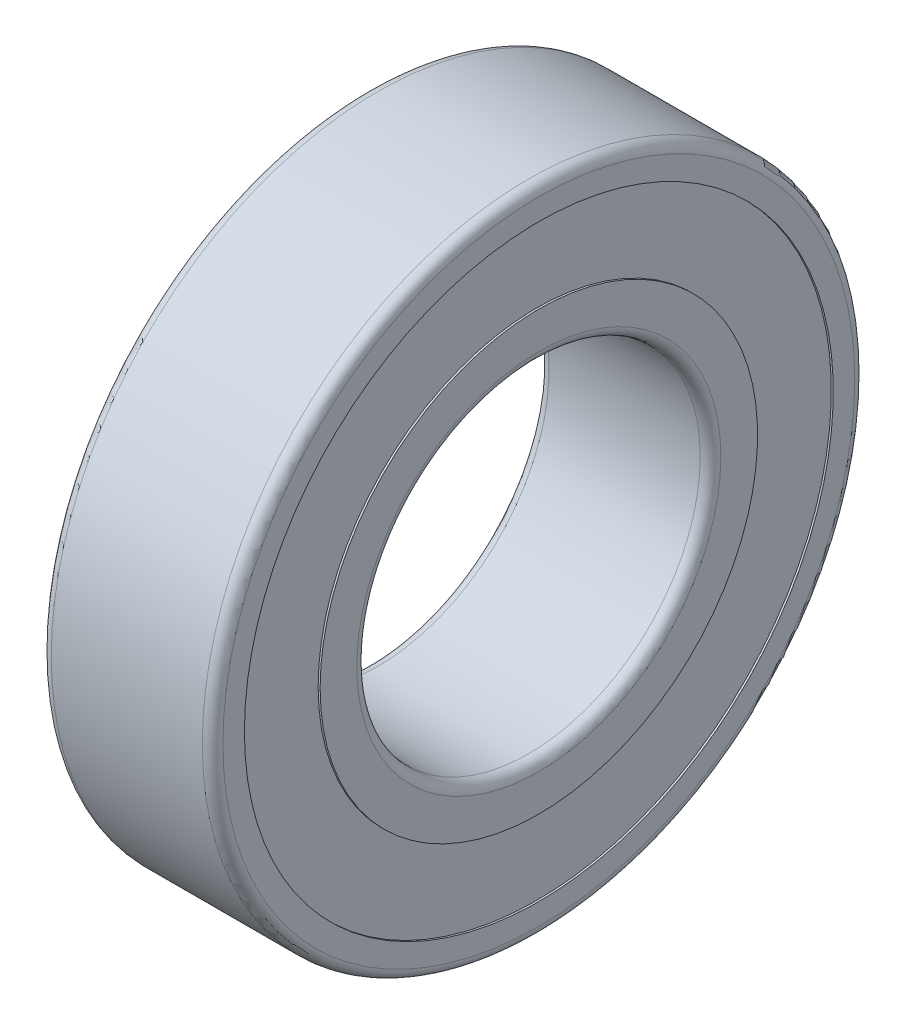
ISO-10303-21;
HEADER;
FILE_DESCRIPTION(('STEP AP214'),'2;1');
FILE_NAME('part.step','',(''),(''),'','','');
FILE_SCHEMA(('AUTOMOTIVE_DESIGN { 1 0 10303 214 1 1 1 1 }'));
ENDSEC;
DATA;
#1=APPLICATION_CONTEXT('core data for automotive mechanical design processes');
#2=APPLICATION_PROTOCOL_DEFINITION('international standard','automotive_design',2000,#1);
#3=PRODUCT_CONTEXT('',#1,'mechanical');
#4=PRODUCT('Part','Part','',(#3));
#5=PRODUCT_RELATED_PRODUCT_CATEGORY('part','',(#4));
#6=PRODUCT_DEFINITION_FORMATION('','',#4);
#7=PRODUCT_DEFINITION_CONTEXT('part definition',#1,'design');
#8=PRODUCT_DEFINITION('design','',#6,#7);
#9=PRODUCT_DEFINITION_SHAPE('','',#8);
#10=(LENGTH_UNIT() NAMED_UNIT(*) SI_UNIT(.MILLI.,.METRE.));
#11=(NAMED_UNIT(*) PLANE_ANGLE_UNIT() SI_UNIT($,.RADIAN.));
#12=(NAMED_UNIT(*) SI_UNIT($,.STERADIAN.) SOLID_ANGLE_UNIT());
#13=UNCERTAINTY_MEASURE_WITH_UNIT(LENGTH_MEASURE(1.E-05),#10,'distance_accuracy_value','');
#14=(GEOMETRIC_REPRESENTATION_CONTEXT(3) GLOBAL_UNCERTAINTY_ASSIGNED_CONTEXT((#13)) GLOBAL_UNIT_ASSIGNED_CONTEXT((#10,
#11,#12)) REPRESENTATION_CONTEXT('',''));
#15=CARTESIAN_POINT('',(0.,0.,0.));
#16=DIRECTION('',(0.,0.,1.));
#17=DIRECTION('',(1.,0.,0.));
#18=AXIS2_PLACEMENT_3D('',#15,#16,#17);
#19=CARTESIAN_POINT('',(0.,0.,0.));
#20=DIRECTION('',(-1.,0.,0.));
#21=DIRECTION('',(0.,0.,1.));
#22=AXIS2_PLACEMENT_3D('',#19,#20,#21);
#23=CYLINDRICAL_SURFACE('',#22,6.37);
#24=CARTESIAN_POINT('',(-0.2575,0.,0.));
#25=DIRECTION('',(-1.,0.,0.));
#26=DIRECTION('',(0.,0.,1.));
#27=AXIS2_PLACEMENT_3D('',#24,#25,#26);
#28=CIRCLE('',#27,6.37);
#29=CARTESIAN_POINT('',(-0.2575,0.,6.37));
#30=VERTEX_POINT('',#29);
#31=EDGE_CURVE('E55',#30,#30,#28,.T.);
#32=ORIENTED_EDGE('',*,*,#31,.T.);
#33=EDGE_LOOP('',(#32));
#34=FACE_BOUND('',#33,.T.);
#35=CARTESIAN_POINT('',(-0.0575000000000003,0.,0.));
#36=DIRECTION('',(-1.,0.,0.));
#37=DIRECTION('',(0.,0.,1.));
#38=AXIS2_PLACEMENT_3D('',#35,#36,#37);
#39=CIRCLE('',#38,6.37);
#40=CARTESIAN_POINT('',(-0.0575000000000003,0.,6.37));
#41=VERTEX_POINT('',#40);
#42=EDGE_CURVE('E11',#41,#41,#39,.T.);
#43=ORIENTED_EDGE('',*,*,#42,.F.);
#44=EDGE_LOOP('',(#43));
#45=FACE_BOUND('',#44,.T.);
#46=ADVANCED_FACE('F41',(#34,#45),#23,.F.);
#47=CARTESIAN_POINT('',(-0.0575000000000003,0.,0.));
#48=DIRECTION('',(-1.,0.,0.));
#49=DIRECTION('',(0.,0.,1.));
#50=AXIS2_PLACEMENT_3D('',#47,#48,#49);
#51=PLANE('',#50);
#52=CARTESIAN_POINT('',(-0.0575000000000003,0.,0.));
#53=DIRECTION('',(-1.,0.,0.));
#54=DIRECTION('',(0.,0.,1.));
#55=AXIS2_PLACEMENT_3D('',#52,#53,#54);
#56=CIRCLE('',#55,8.575);
#57=CARTESIAN_POINT('',(-0.0575000000000003,0.,8.575));
#58=VERTEX_POINT('',#57);
#59=EDGE_CURVE('E47',#58,#58,#56,.T.);
#60=ORIENTED_EDGE('',*,*,#59,.F.);
#61=EDGE_LOOP('',(#60));
#62=FACE_BOUND('',#61,.T.);
#63=ORIENTED_EDGE('',*,*,#42,.T.);
#64=EDGE_LOOP('',(#63));
#65=FACE_BOUND('',#64,.T.);
#66=ADVANCED_FACE('F71',(#62,#65),#51,.F.);
#67=CARTESIAN_POINT('',(0.,0.,0.));
#68=DIRECTION('',(-1.,0.,0.));
#69=DIRECTION('',(0.,0.,1.));
#70=AXIS2_PLACEMENT_3D('',#67,#68,#69);
#71=CYLINDRICAL_SURFACE('',#70,8.575);
#72=ORIENTED_EDGE('',*,*,#59,.T.);
#73=EDGE_LOOP('',(#72));
#74=FACE_BOUND('',#73,.T.);
#75=CARTESIAN_POINT('',(-0.2575,0.,0.));
#76=DIRECTION('',(-1.,0.,0.));
#77=DIRECTION('',(0.,0.,1.));
#78=AXIS2_PLACEMENT_3D('',#75,#76,#77);
#79=CIRCLE('',#78,8.575);
#80=CARTESIAN_POINT('',(-0.2575,0.,8.575));
#81=VERTEX_POINT('',#80);
#82=EDGE_CURVE('E51',#81,#81,#79,.T.);
#83=ORIENTED_EDGE('',*,*,#82,.F.);
#84=EDGE_LOOP('',(#83));
#85=FACE_BOUND('',#84,.T.);
#86=ADVANCED_FACE('F65',(#74,#85),#71,.T.);
#87=CARTESIAN_POINT('',(-0.2575,0.,0.));
#88=DIRECTION('',(-1.,0.,0.));
#89=DIRECTION('',(0.,0.,1.));
#90=AXIS2_PLACEMENT_3D('',#87,#88,#89);
#91=PLANE('',#90);
#92=ORIENTED_EDGE('',*,*,#82,.T.);
#93=EDGE_LOOP('',(#92));
#94=FACE_BOUND('',#93,.T.);
#95=ORIENTED_EDGE('',*,*,#31,.F.);
#96=EDGE_LOOP('',(#95));
#97=FACE_BOUND('',#96,.T.);
#98=ADVANCED_FACE('F63',(#94,#97),#91,.T.);
#99=CLOSED_SHELL('',(#46,#66,#86,#98));
#100=MANIFOLD_SOLID_BREP('B2',#99);
#101=CARTESIAN_POINT('',(-4.9425,0.,0.));
#102=DIRECTION('',(-1.,0.,0.));
#103=DIRECTION('',(0.,0.,1.));
#104=AXIS2_PLACEMENT_3D('',#101,#102,#103);
#105=PLANE('',#104);
#106=CARTESIAN_POINT('',(-4.9425,0.,0.));
#107=DIRECTION('',(-1.,0.,0.));
#108=DIRECTION('',(0.,0.,1.));
#109=AXIS2_PLACEMENT_3D('',#106,#107,#108);
#110=CIRCLE('',#109,8.575);
#111=CARTESIAN_POINT('',(-4.9425,0.,8.575));
#112=VERTEX_POINT('',#111);
#113=EDGE_CURVE('E134',#112,#112,#110,.T.);
#114=ORIENTED_EDGE('',*,*,#113,.T.);
#115=EDGE_LOOP('',(#114));
#116=FACE_BOUND('',#115,.T.);
#117=CARTESIAN_POINT('',(-4.9425,0.,0.));
#118=DIRECTION('',(-1.,0.,0.));
#119=DIRECTION('',(0.,0.,1.));
#120=AXIS2_PLACEMENT_3D('',#117,#118,#119);
#121=CIRCLE('',#120,6.37);
#122=CARTESIAN_POINT('',(-4.9425,0.,6.37));
#123=VERTEX_POINT('',#122);
#124=EDGE_CURVE('E40',#123,#123,#121,.T.);
#125=ORIENTED_EDGE('',*,*,#124,.F.);
#126=EDGE_LOOP('',(#125));
#127=FACE_BOUND('',#126,.T.);
#128=ADVANCED_FACE('F120',(#116,#127),#105,.T.);
#129=CARTESIAN_POINT('',(0.,0.,0.));
#130=DIRECTION('',(-1.,0.,0.));
#131=DIRECTION('',(0.,0.,1.));
#132=AXIS2_PLACEMENT_3D('',#129,#130,#131);
#133=CYLINDRICAL_SURFACE('',#132,6.37);
#134=ORIENTED_EDGE('',*,*,#124,.T.);
#135=EDGE_LOOP('',(#134));
#136=FACE_BOUND('',#135,.T.);
#137=CARTESIAN_POINT('',(-4.7425,0.,0.));
#138=DIRECTION('',(-1.,0.,0.));
#139=DIRECTION('',(0.,0.,1.));
#140=AXIS2_PLACEMENT_3D('',#137,#138,#139);
#141=CIRCLE('',#140,6.37);
#142=CARTESIAN_POINT('',(-4.7425,0.,6.37));
#143=VERTEX_POINT('',#142);
#144=EDGE_CURVE('E126',#143,#143,#141,.T.);
#145=ORIENTED_EDGE('',*,*,#144,.F.);
#146=EDGE_LOOP('',(#145));
#147=FACE_BOUND('',#146,.T.);
#148=ADVANCED_FACE('F150',(#136,#147),#133,.F.);
#149=CARTESIAN_POINT('',(-4.7425,0.,0.));
#150=DIRECTION('',(1.,0.,0.));
#151=DIRECTION('',(0.,0.,-1.));
#152=AXIS2_PLACEMENT_3D('',#149,#150,#151);
#153=PLANE('',#152);
#154=ORIENTED_EDGE('',*,*,#144,.T.);
#155=EDGE_LOOP('',(#154));
#156=FACE_BOUND('',#155,.T.);
#157=CARTESIAN_POINT('',(-4.7425,0.,0.));
#158=DIRECTION('',(-1.,0.,0.));
#159=DIRECTION('',(0.,0.,1.));
#160=AXIS2_PLACEMENT_3D('',#157,#158,#159);
#161=CIRCLE('',#160,8.575);
#162=CARTESIAN_POINT('',(-4.7425,0.,8.575));
#163=VERTEX_POINT('',#162);
#164=EDGE_CURVE('E130',#163,#163,#161,.T.);
#165=ORIENTED_EDGE('',*,*,#164,.F.);
#166=EDGE_LOOP('',(#165));
#167=FACE_BOUND('',#166,.T.);
#168=ADVANCED_FACE('F144',(#156,#167),#153,.T.);
#169=CARTESIAN_POINT('',(0.,0.,0.));
#170=DIRECTION('',(-1.,0.,0.));
#171=DIRECTION('',(0.,0.,1.));
#172=AXIS2_PLACEMENT_3D('',#169,#170,#171);
#173=CYLINDRICAL_SURFACE('',#172,8.575);
#174=ORIENTED_EDGE('',*,*,#164,.T.);
#175=EDGE_LOOP('',(#174));
#176=FACE_BOUND('',#175,.T.);
#177=ORIENTED_EDGE('',*,*,#113,.F.);
#178=EDGE_LOOP('',(#177));
#179=FACE_BOUND('',#178,.T.);
#180=ADVANCED_FACE('F142',(#176,#179),#173,.T.);
#181=CLOSED_SHELL('',(#128,#148,#168,#180));
#182=MANIFOLD_SOLID_BREP('B6',#181);
#183=CARTESIAN_POINT('',(-2.5,6.04537949046685,4.39222529775543));
#184=DIRECTION('',(-1.,0.,0.));
#185=DIRECTION('',(0.,0.809016994374955,0.587785252292462));
#186=AXIS2_PLACEMENT_3D('',#183,#184,#185);
#187=SPHERICAL_SURFACE('',#186,1.25);
#188=CARTESIAN_POINT('',(-3.75,6.04537949046685,4.39222529775543));
#189=VERTEX_POINT('',#188);
#190=VERTEX_LOOP('',#189);
#191=FACE_BOUND('',#190,.T.);
#192=ADVANCED_FACE('F199',(#191),#187,.T.);
#193=CLOSED_SHELL('',(#192));
#194=MANIFOLD_SOLID_BREP('B35',#193);
#195=CARTESIAN_POINT('',(-2.5,2.30912949046688,7.10676981801551));
#196=DIRECTION('',(-1.,0.,0.));
#197=DIRECTION('',(0.,0.309016994374958,0.95105651629515));
#198=AXIS2_PLACEMENT_3D('',#195,#196,#197);
#199=SPHERICAL_SURFACE('',#198,1.25);
#200=CARTESIAN_POINT('',(-3.75,2.30912949046688,7.10676981801551));
#201=VERTEX_POINT('',#200);
#202=VERTEX_LOOP('',#201);
#203=FACE_BOUND('',#202,.T.);
#204=ADVANCED_FACE('F220',(#203),#199,.T.);
#205=CLOSED_SHELL('',(#204));
#206=MANIFOLD_SOLID_BREP('B116',#205);
#207=CARTESIAN_POINT('',(-2.5,-2.30912949046673,7.10676981801556));
#208=DIRECTION('',(-1.,0.,0.));
#209=DIRECTION('',(0.,-0.309016994374938,0.951056516295157));
#210=AXIS2_PLACEMENT_3D('',#207,#208,#209);
#211=SPHERICAL_SURFACE('',#210,1.25);
#212=CARTESIAN_POINT('',(-3.75,-2.30912949046673,7.10676981801556));
#213=VERTEX_POINT('',#212);
#214=VERTEX_LOOP('',#213);
#215=FACE_BOUND('',#214,.T.);
#216=ADVANCED_FACE('F241',(#215),#211,.T.);
#217=CLOSED_SHELL('',(#216));
#218=MANIFOLD_SOLID_BREP('B195',#217);
#219=CARTESIAN_POINT('',(-2.5,-6.04537949046676,4.39222529775556));
#220=DIRECTION('',(-1.,0.,0.));
#221=DIRECTION('',(0.,-0.809016994374942,0.58778525229248));
#222=AXIS2_PLACEMENT_3D('',#219,#220,#221);
#223=SPHERICAL_SURFACE('',#222,1.25);
#224=CARTESIAN_POINT('',(-3.75,-6.04537949046676,4.39222529775556));
#225=VERTEX_POINT('',#224);
#226=VERTEX_LOOP('',#225);
#227=FACE_BOUND('',#226,.T.);
#228=ADVANCED_FACE('F262',(#227),#223,.T.);
#229=CLOSED_SHELL('',(#228));
#230=MANIFOLD_SOLID_BREP('B216',#229);
#231=CARTESIAN_POINT('',(-2.5,-7.4725,0.));
#232=DIRECTION('',(-1.,0.,0.));
#233=DIRECTION('',(0.,-1.,0.));
#234=AXIS2_PLACEMENT_3D('',#231,#232,#233);
#235=SPHERICAL_SURFACE('',#234,1.25);
#236=CARTESIAN_POINT('',(-3.75,-7.4725,0.));
#237=VERTEX_POINT('',#236);
#238=VERTEX_LOOP('',#237);
#239=FACE_BOUND('',#238,.T.);
#240=ADVANCED_FACE('F283',(#239),#235,.T.);
#241=CLOSED_SHELL('',(#240));
#242=MANIFOLD_SOLID_BREP('B237',#241);
#243=CARTESIAN_POINT('',(-2.5,-6.04537949046682,-4.39222529775547));
#244=DIRECTION('',(-1.,0.,0.));
#245=DIRECTION('',(0.,-0.809016994374951,-0.587785252292469));
#246=AXIS2_PLACEMENT_3D('',#243,#244,#245);
#247=SPHERICAL_SURFACE('',#246,1.25);
#248=CARTESIAN_POINT('',(-3.75,-6.04537949046682,-4.39222529775547));
#249=VERTEX_POINT('',#248);
#250=VERTEX_LOOP('',#249);
#251=FACE_BOUND('',#250,.T.);
#252=ADVANCED_FACE('F304',(#251),#247,.T.);
#253=CLOSED_SHELL('',(#252));
#254=MANIFOLD_SOLID_BREP('B258',#253);
#255=CARTESIAN_POINT('',(-2.5,-2.30912949046683,-7.10676981801553));
#256=DIRECTION('',(-1.,0.,0.));
#257=DIRECTION('',(0.,-0.309016994374952,-0.951056516295152));
#258=AXIS2_PLACEMENT_3D('',#255,#256,#257);
#259=SPHERICAL_SURFACE('',#258,1.25);
#260=CARTESIAN_POINT('',(-3.75,-2.30912949046683,-7.10676981801553));
#261=VERTEX_POINT('',#260);
#262=VERTEX_LOOP('',#261);
#263=FACE_BOUND('',#262,.T.);
#264=ADVANCED_FACE('F325',(#263),#259,.T.);
#265=CLOSED_SHELL('',(#264));
#266=MANIFOLD_SOLID_BREP('B279',#265);
#267=CARTESIAN_POINT('',(-2.5,2.30912949046677,-7.10676981801554));
#268=DIRECTION('',(-1.,0.,0.));
#269=DIRECTION('',(0.,0.309016994374945,-0.951056516295155));
#270=AXIS2_PLACEMENT_3D('',#267,#268,#269);
#271=SPHERICAL_SURFACE('',#270,1.25);
#272=CARTESIAN_POINT('',(-3.75,2.30912949046677,-7.10676981801554));
#273=VERTEX_POINT('',#272);
#274=VERTEX_LOOP('',#273);
#275=FACE_BOUND('',#274,.T.);
#276=ADVANCED_FACE('F346',(#275),#271,.T.);
#277=CLOSED_SHELL('',(#276));
#278=MANIFOLD_SOLID_BREP('B300',#277);
#279=CARTESIAN_POINT('',(-2.5,6.04537949046679,-4.39222529775551));
#280=DIRECTION('',(-1.,0.,0.));
#281=DIRECTION('',(0.,0.809016994374947,-0.587785252292474));
#282=AXIS2_PLACEMENT_3D('',#279,#280,#281);
#283=SPHERICAL_SURFACE('',#282,1.25);
#284=CARTESIAN_POINT('',(-3.75,6.04537949046679,-4.39222529775551));
#285=VERTEX_POINT('',#284);
#286=VERTEX_LOOP('',#285);
#287=FACE_BOUND('',#286,.T.);
#288=ADVANCED_FACE('F367',(#287),#283,.T.);
#289=CLOSED_SHELL('',(#288));
#290=MANIFOLD_SOLID_BREP('B321',#289);
#291=CARTESIAN_POINT('',(-2.5,7.4725,0.));
#292=DIRECTION('',(-1.,0.,0.));
#293=DIRECTION('',(0.,1.,0.));
#294=AXIS2_PLACEMENT_3D('',#291,#292,#293);
#295=SPHERICAL_SURFACE('',#294,1.25);
#296=CARTESIAN_POINT('',(-3.75,7.4725,0.));
#297=VERTEX_POINT('',#296);
#298=VERTEX_LOOP('',#297);
#299=FACE_BOUND('',#298,.T.);
#300=ADVANCED_FACE('F390',(#299),#295,.T.);
#301=CLOSED_SHELL('',(#300));
#302=MANIFOLD_SOLID_BREP('B342',#301);
#303=CARTESIAN_POINT('',(0.,0.,0.));
#304=DIRECTION('',(-1.,0.,0.));
#305=DIRECTION('',(0.,0.,1.));
#306=AXIS2_PLACEMENT_3D('',#303,#304,#305);
#307=CYLINDRICAL_SURFACE('',#306,8.4225);
#308=CARTESIAN_POINT('',(-3.3124038404636,0.,0.));
#309=DIRECTION('',(-1.,0.,0.));
#310=DIRECTION('',(0.,0.,1.));
#311=AXIS2_PLACEMENT_3D('',#308,#309,#310);
#312=CIRCLE('',#311,8.4225);
#313=CARTESIAN_POINT('',(-3.3124038404636,0.,8.4225));
#314=VERTEX_POINT('',#313);
#315=EDGE_CURVE('E432',#314,#314,#312,.T.);
#316=ORIENTED_EDGE('',*,*,#315,.F.);
#317=EDGE_LOOP('',(#316));
#318=FACE_BOUND('',#317,.T.);
#319=CARTESIAN_POINT('',(-4.7425,0.,0.));
#320=DIRECTION('',(-1.,0.,0.));
#321=DIRECTION('',(0.,0.,1.));
#322=AXIS2_PLACEMENT_3D('',#319,#320,#321);
#323=CIRCLE('',#322,8.4225);
#324=CARTESIAN_POINT('',(-4.7425,0.,8.4225));
#325=VERTEX_POINT('',#324);
#326=EDGE_CURVE('E453',#325,#325,#323,.T.);
#327=ORIENTED_EDGE('',*,*,#326,.T.);
#328=EDGE_LOOP('',(#327));
#329=FACE_BOUND('',#328,.T.);
#330=ADVANCED_FACE('F412',(#318,#329),#307,.F.);
#331=CARTESIAN_POINT('',(-2.5,0.,0.));
#332=DIRECTION('',(-1.,0.,0.));
#333=DIRECTION('',(0.,0.,1.));
#334=AXIS2_PLACEMENT_3D('',#331,#332,#333);
#335=TOROIDAL_SURFACE('',#334,7.4725,1.25);
#336=CARTESIAN_POINT('',(-1.6875961595364,0.,0.));
#337=DIRECTION('',(-1.,0.,0.));
#338=DIRECTION('',(0.,0.,1.));
#339=AXIS2_PLACEMENT_3D('',#336,#337,#338);
#340=CIRCLE('',#339,8.4225);
#341=CARTESIAN_POINT('',(-1.6875961595364,0.,8.4225));
#342=VERTEX_POINT('',#341);
#343=EDGE_CURVE('E435',#342,#342,#340,.T.);
#344=ORIENTED_EDGE('',*,*,#343,.F.);
#345=EDGE_LOOP('',(#344));
#346=FACE_BOUND('',#345,.T.);
#347=ORIENTED_EDGE('',*,*,#315,.T.);
#348=EDGE_LOOP('',(#347));
#349=FACE_BOUND('',#348,.T.);
#350=ADVANCED_FACE('F482',(#346,#349),#335,.F.);
#351=CARTESIAN_POINT('',(0.,0.,0.));
#352=DIRECTION('',(-1.,0.,0.));
#353=DIRECTION('',(0.,0.,1.));
#354=AXIS2_PLACEMENT_3D('',#351,#352,#353);
#355=CYLINDRICAL_SURFACE('',#354,8.4225);
#356=CARTESIAN_POINT('',(-0.2575,0.,0.));
#357=DIRECTION('',(-1.,0.,0.));
#358=DIRECTION('',(0.,0.,1.));
#359=AXIS2_PLACEMENT_3D('',#356,#357,#358);
#360=CIRCLE('',#359,8.4225);
#361=CARTESIAN_POINT('',(-0.2575,0.,8.4225));
#362=VERTEX_POINT('',#361);
#363=EDGE_CURVE('E438',#362,#362,#360,.T.);
#364=ORIENTED_EDGE('',*,*,#363,.F.);
#365=EDGE_LOOP('',(#364));
#366=FACE_BOUND('',#365,.T.);
#367=ORIENTED_EDGE('',*,*,#343,.T.);
#368=EDGE_LOOP('',(#367));
#369=FACE_BOUND('',#368,.T.);
#370=ADVANCED_FACE('F488',(#366,#369),#355,.F.);
#371=CARTESIAN_POINT('',(-0.2575,0.,0.));
#372=DIRECTION('',(-1.,0.,0.));
#373=DIRECTION('',(0.,0.,1.));
#374=AXIS2_PLACEMENT_3D('',#371,#372,#373);
#375=PLANE('',#374);
#376=CARTESIAN_POINT('',(-0.2575,0.,0.));
#377=DIRECTION('',(-1.,0.,0.));
#378=DIRECTION('',(0.,0.,1.));
#379=AXIS2_PLACEMENT_3D('',#376,#377,#378);
#380=CIRCLE('',#379,8.575);
#381=CARTESIAN_POINT('',(-0.2575,0.,8.575));
#382=VERTEX_POINT('',#381);
#383=EDGE_CURVE('E441',#382,#382,#380,.T.);
#384=ORIENTED_EDGE('',*,*,#383,.F.);
#385=EDGE_LOOP('',(#384));
#386=FACE_BOUND('',#385,.T.);
#387=ORIENTED_EDGE('',*,*,#363,.T.);
#388=EDGE_LOOP('',(#387));
#389=FACE_BOUND('',#388,.T.);
#390=ADVANCED_FACE('F552',(#386,#389),#375,.F.);
#391=CARTESIAN_POINT('',(0.,0.,0.));
#392=DIRECTION('',(-1.,0.,0.));
#393=DIRECTION('',(0.,0.,1.));
#394=AXIS2_PLACEMENT_3D('',#391,#392,#393);
#395=CYLINDRICAL_SURFACE('',#394,8.575);
#396=CARTESIAN_POINT('',(0.,0.,0.));
#397=DIRECTION('',(-1.,0.,0.));
#398=DIRECTION('',(0.,0.,1.));
#399=AXIS2_PLACEMENT_3D('',#396,#397,#398);
#400=CIRCLE('',#399,8.575);
#401=CARTESIAN_POINT('',(0.,0.,8.575));
#402=VERTEX_POINT('',#401);
#403=EDGE_CURVE('E444',#402,#402,#400,.T.);
#404=ORIENTED_EDGE('',*,*,#403,.F.);
#405=EDGE_LOOP('',(#404));
#406=FACE_BOUND('',#405,.T.);
#407=ORIENTED_EDGE('',*,*,#383,.T.);
#408=EDGE_LOOP('',(#407));
#409=FACE_BOUND('',#408,.T.);
#410=ADVANCED_FACE('F531',(#406,#409),#395,.F.);
#411=CARTESIAN_POINT('',(0.,0.,0.));
#412=DIRECTION('',(-1.,0.,0.));
#413=DIRECTION('',(0.,0.,1.));
#414=AXIS2_PLACEMENT_3D('',#411,#412,#413);
#415=PLANE('',#414);
#416=CARTESIAN_POINT('',(0.,0.,0.));
#417=DIRECTION('',(-1.,0.,0.));
#418=DIRECTION('',(0.,0.,1.));
#419=AXIS2_PLACEMENT_3D('',#416,#417,#418);
#420=CIRCLE('',#419,9.2);
#421=CARTESIAN_POINT('',(0.,0.,9.2));
#422=VERTEX_POINT('',#421);
#423=EDGE_CURVE('E419',#422,#422,#420,.F.);
#424=ORIENTED_EDGE('',*,*,#423,.T.);
#425=EDGE_LOOP('',(#424));
#426=FACE_BOUND('',#425,.T.);
#427=ORIENTED_EDGE('',*,*,#403,.T.);
#428=EDGE_LOOP('',(#427));
#429=FACE_BOUND('',#428,.T.);
#430=ADVANCED_FACE('F478',(#426,#429),#415,.F.);
#431=CARTESIAN_POINT('',(0.,0.,0.));
#432=DIRECTION('',(-1.,0.,0.));
#433=DIRECTION('',(0.,0.,1.));
#434=AXIS2_PLACEMENT_3D('',#431,#432,#433);
#435=CYLINDRICAL_SURFACE('',#434,9.5);
#436=CARTESIAN_POINT('',(-0.3,0.,0.));
#437=DIRECTION('',(-1.,0.,0.));
#438=DIRECTION('',(0.,0.,1.));
#439=AXIS2_PLACEMENT_3D('',#436,#437,#438);
#440=CIRCLE('',#439,9.5);
#441=CARTESIAN_POINT('',(-0.3,0.,9.5));
#442=VERTEX_POINT('',#441);
#443=EDGE_CURVE('E423',#442,#442,#440,.T.);
#444=ORIENTED_EDGE('',*,*,#443,.T.);
#445=EDGE_LOOP('',(#444));
#446=FACE_BOUND('',#445,.T.);
#447=CARTESIAN_POINT('',(-4.7,0.,0.));
#448=DIRECTION('',(1.,0.,0.));
#449=DIRECTION('',(0.,0.,-1.));
#450=AXIS2_PLACEMENT_3D('',#447,#448,#449);
#451=CIRCLE('',#450,9.5);
#452=CARTESIAN_POINT('',(-4.7,0.,-9.5));
#453=VERTEX_POINT('',#452);
#454=EDGE_CURVE('E427',#453,#453,#451,.T.);
#455=ORIENTED_EDGE('',*,*,#454,.T.);
#456=EDGE_LOOP('',(#455));
#457=FACE_BOUND('',#456,.T.);
#458=ADVANCED_FACE('F473',(#446,#457),#435,.T.);
#459=CARTESIAN_POINT('',(-5.,0.,0.));
#460=DIRECTION('',(1.,0.,0.));
#461=DIRECTION('',(0.,0.,-1.));
#462=AXIS2_PLACEMENT_3D('',#459,#460,#461);
#463=PLANE('',#462);
#464=CARTESIAN_POINT('',(-5.,0.,0.));
#465=DIRECTION('',(1.,0.,0.));
#466=DIRECTION('',(0.,0.,-1.));
#467=AXIS2_PLACEMENT_3D('',#464,#465,#466);
#468=CIRCLE('',#467,9.2);
#469=CARTESIAN_POINT('',(-5.,0.,-9.2));
#470=VERTEX_POINT('',#469);
#471=EDGE_CURVE('E389',#470,#470,#468,.F.);
#472=ORIENTED_EDGE('',*,*,#471,.T.);
#473=EDGE_LOOP('',(#472));
#474=FACE_BOUND('',#473,.T.);
#475=CARTESIAN_POINT('',(-5.,0.,0.));
#476=DIRECTION('',(-1.,0.,0.));
#477=DIRECTION('',(0.,0.,1.));
#478=AXIS2_PLACEMENT_3D('',#475,#476,#477);
#479=CIRCLE('',#478,8.575);
#480=CARTESIAN_POINT('',(-5.,0.,8.575));
#481=VERTEX_POINT('',#480);
#482=EDGE_CURVE('E447',#481,#481,#479,.T.);
#483=ORIENTED_EDGE('',*,*,#482,.F.);
#484=EDGE_LOOP('',(#483));
#485=FACE_BOUND('',#484,.T.);
#486=ADVANCED_FACE('F468',(#474,#485),#463,.F.);
#487=CARTESIAN_POINT('',(0.,0.,0.));
#488=DIRECTION('',(-1.,0.,0.));
#489=DIRECTION('',(0.,0.,1.));
#490=AXIS2_PLACEMENT_3D('',#487,#488,#489);
#491=CYLINDRICAL_SURFACE('',#490,8.575);
#492=CARTESIAN_POINT('',(-4.7425,0.,0.));
#493=DIRECTION('',(-1.,0.,0.));
#494=DIRECTION('',(0.,0.,1.));
#495=AXIS2_PLACEMENT_3D('',#492,#493,#494);
#496=CIRCLE('',#495,8.575);
#497=CARTESIAN_POINT('',(-4.7425,0.,8.575));
#498=VERTEX_POINT('',#497);
#499=EDGE_CURVE('E450',#498,#498,#496,.T.);
#500=ORIENTED_EDGE('',*,*,#499,.F.);
#501=EDGE_LOOP('',(#500));
#502=FACE_BOUND('',#501,.T.);
#503=ORIENTED_EDGE('',*,*,#482,.T.);
#504=EDGE_LOOP('',(#503));
#505=FACE_BOUND('',#504,.T.);
#506=ADVANCED_FACE('F462',(#502,#505),#491,.F.);
#507=CARTESIAN_POINT('',(-4.7425,0.,0.));
#508=DIRECTION('',(1.,0.,0.));
#509=DIRECTION('',(0.,0.,-1.));
#510=AXIS2_PLACEMENT_3D('',#507,#508,#509);
#511=PLANE('',#510);
#512=ORIENTED_EDGE('',*,*,#326,.F.);
#513=EDGE_LOOP('',(#512));
#514=FACE_BOUND('',#513,.T.);
#515=ORIENTED_EDGE('',*,*,#499,.T.);
#516=EDGE_LOOP('',(#515));
#517=FACE_BOUND('',#516,.T.);
#518=ADVANCED_FACE('F458',(#514,#517),#511,.F.);
#519=CARTESIAN_POINT('',(-0.3,0.,0.));
#520=DIRECTION('',(-1.,0.,0.));
#521=DIRECTION('',(0.,0.,1.));
#522=AXIS2_PLACEMENT_3D('',#519,#520,#521);
#523=TOROIDAL_SURFACE('',#522,9.2,0.3);
#524=ORIENTED_EDGE('',*,*,#423,.F.);
#525=EDGE_LOOP('',(#524));
#526=FACE_BOUND('',#525,.T.);
#527=ORIENTED_EDGE('',*,*,#443,.F.);
#528=EDGE_LOOP('',(#527));
#529=FACE_BOUND('',#528,.T.);
#530=ADVANCED_FACE('F461',(#526,#529),#523,.T.);
#531=CARTESIAN_POINT('',(-4.7,0.,0.));
#532=DIRECTION('',(1.,0.,0.));
#533=DIRECTION('',(0.,0.,-1.));
#534=AXIS2_PLACEMENT_3D('',#531,#532,#533);
#535=TOROIDAL_SURFACE('',#534,9.2,0.3);
#536=ORIENTED_EDGE('',*,*,#454,.F.);
#537=EDGE_LOOP('',(#536));
#538=FACE_BOUND('',#537,.T.);
#539=ORIENTED_EDGE('',*,*,#471,.F.);
#540=EDGE_LOOP('',(#539));
#541=FACE_BOUND('',#540,.T.);
#542=ADVANCED_FACE('F414',(#538,#541),#535,.T.);
#543=CLOSED_SHELL('',(#330,#350,#370,#390,#410,#430,#458,#486,#506,#518,#530,#542));
#544=MANIFOLD_SOLID_BREP('B363',#543);
#545=CARTESIAN_POINT('',(-2.5,0.,0.));
#546=DIRECTION('',(-1.,0.,0.));
#547=DIRECTION('',(0.,0.,1.));
#548=AXIS2_PLACEMENT_3D('',#545,#546,#547);
#549=TOROIDAL_SURFACE('',#548,7.4725,1.25);
#550=CARTESIAN_POINT('',(-1.6875961595364,0.,0.));
#551=DIRECTION('',(-1.,0.,0.));
#552=DIRECTION('',(0.,0.,1.));
#553=AXIS2_PLACEMENT_3D('',#550,#551,#552);
#554=CIRCLE('',#553,6.5225);
#555=CARTESIAN_POINT('',(-1.6875961595364,0.,6.5225));
#556=VERTEX_POINT('',#555);
#557=EDGE_CURVE('E649',#556,#556,#554,.T.);
#558=ORIENTED_EDGE('',*,*,#557,.T.);
#559=EDGE_LOOP('',(#558));
#560=FACE_BOUND('',#559,.T.);
#561=CARTESIAN_POINT('',(-3.3124038404636,0.,0.));
#562=DIRECTION('',(-1.,0.,0.));
#563=DIRECTION('',(0.,0.,1.));
#564=AXIS2_PLACEMENT_3D('',#561,#562,#563);
#565=CIRCLE('',#564,6.5225);
#566=CARTESIAN_POINT('',(-3.3124038404636,0.,6.5225));
#567=VERTEX_POINT('',#566);
#568=EDGE_CURVE('E628',#567,#567,#565,.T.);
#569=ORIENTED_EDGE('',*,*,#568,.F.);
#570=EDGE_LOOP('',(#569));
#571=FACE_BOUND('',#570,.T.);
#572=ADVANCED_FACE('F608',(#560,#571),#549,.F.);
#573=CARTESIAN_POINT('',(0.,0.,0.));
#574=DIRECTION('',(-1.,0.,0.));
#575=DIRECTION('',(0.,0.,1.));
#576=AXIS2_PLACEMENT_3D('',#573,#574,#575);
#577=CYLINDRICAL_SURFACE('',#576,6.5225);
#578=ORIENTED_EDGE('',*,*,#568,.T.);
#579=EDGE_LOOP('',(#578));
#580=FACE_BOUND('',#579,.T.);
#581=CARTESIAN_POINT('',(-4.7425,0.,0.));
#582=DIRECTION('',(-1.,0.,0.));
#583=DIRECTION('',(0.,0.,1.));
#584=AXIS2_PLACEMENT_3D('',#581,#582,#583);
#585=CIRCLE('',#584,6.5225);
#586=CARTESIAN_POINT('',(-4.7425,0.,6.5225));
#587=VERTEX_POINT('',#586);
#588=EDGE_CURVE('E631',#587,#587,#585,.T.);
#589=ORIENTED_EDGE('',*,*,#588,.F.);
#590=EDGE_LOOP('',(#589));
#591=FACE_BOUND('',#590,.T.);
#592=ADVANCED_FACE('F670',(#580,#591),#577,.T.);
#593=CARTESIAN_POINT('',(-4.7425,0.,0.));
#594=DIRECTION('',(1.,0.,0.));
#595=DIRECTION('',(0.,0.,-1.));
#596=AXIS2_PLACEMENT_3D('',#593,#594,#595);
#597=PLANE('',#596);
#598=CARTESIAN_POINT('',(-4.7425,0.,0.));
#599=DIRECTION('',(-1.,0.,0.));
#600=DIRECTION('',(0.,0.,1.));
#601=AXIS2_PLACEMENT_3D('',#598,#599,#600);
#602=CIRCLE('',#601,6.37);
#603=CARTESIAN_POINT('',(-4.7425,0.,6.37));
#604=VERTEX_POINT('',#603);
#605=EDGE_CURVE('E634',#604,#604,#602,.T.);
#606=ORIENTED_EDGE('',*,*,#605,.F.);
#607=EDGE_LOOP('',(#606));
#608=FACE_BOUND('',#607,.T.);
#609=ORIENTED_EDGE('',*,*,#588,.T.);
#610=EDGE_LOOP('',(#609));
#611=FACE_BOUND('',#610,.T.);
#612=ADVANCED_FACE('F675',(#608,#611),#597,.F.);
#613=CARTESIAN_POINT('',(0.,0.,0.));
#614=DIRECTION('',(-1.,0.,0.));
#615=DIRECTION('',(0.,0.,1.));
#616=AXIS2_PLACEMENT_3D('',#613,#614,#615);
#617=CYLINDRICAL_SURFACE('',#616,6.37);
#618=CARTESIAN_POINT('',(-5.,0.,0.));
#619=DIRECTION('',(-1.,0.,0.));
#620=DIRECTION('',(0.,0.,1.));
#621=AXIS2_PLACEMENT_3D('',#618,#619,#620);
#622=CIRCLE('',#621,6.37);
#623=CARTESIAN_POINT('',(-5.,0.,6.37));
#624=VERTEX_POINT('',#623);
#625=EDGE_CURVE('E637',#624,#624,#622,.T.);
#626=ORIENTED_EDGE('',*,*,#625,.F.);
#627=EDGE_LOOP('',(#626));
#628=FACE_BOUND('',#627,.T.);
#629=ORIENTED_EDGE('',*,*,#605,.T.);
#630=EDGE_LOOP('',(#629));
#631=FACE_BOUND('',#630,.T.);
#632=ADVANCED_FACE('F681',(#628,#631),#617,.T.);
#633=CARTESIAN_POINT('',(-5.,0.,0.));
#634=DIRECTION('',(-1.,0.,0.));
#635=DIRECTION('',(0.,0.,1.));
#636=AXIS2_PLACEMENT_3D('',#633,#634,#635);
#637=PLANE('',#636);
#638=CARTESIAN_POINT('',(-5.,0.,0.));
#639=DIRECTION('',(-1.,0.,0.));
#640=DIRECTION('',(0.,0.,1.));
#641=AXIS2_PLACEMENT_3D('',#638,#639,#640);
#642=CIRCLE('',#641,5.3);
#643=CARTESIAN_POINT('',(-5.,0.,5.3));
#644=VERTEX_POINT('',#643);
#645=EDGE_CURVE('E411',#644,#644,#642,.F.);
#646=ORIENTED_EDGE('',*,*,#645,.T.);
#647=EDGE_LOOP('',(#646));
#648=FACE_BOUND('',#647,.T.);
#649=ORIENTED_EDGE('',*,*,#625,.T.);
#650=EDGE_LOOP('',(#649));
#651=FACE_BOUND('',#650,.T.);
#652=ADVANCED_FACE('F685',(#648,#651),#637,.T.);
#653=CARTESIAN_POINT('',(0.,0.,0.));
#654=DIRECTION('',(-1.,0.,0.));
#655=DIRECTION('',(0.,0.,1.));
#656=AXIS2_PLACEMENT_3D('',#653,#654,#655);
#657=CYLINDRICAL_SURFACE('',#656,5.);
#658=CARTESIAN_POINT('',(-0.3,0.,0.));
#659=DIRECTION('',(1.,0.,0.));
#660=DIRECTION('',(0.,0.,-1.));
#661=AXIS2_PLACEMENT_3D('',#658,#659,#660);
#662=CIRCLE('',#661,5.);
#663=CARTESIAN_POINT('',(-0.3,0.,-5.));
#664=VERTEX_POINT('',#663);
#665=EDGE_CURVE('E615',#664,#664,#662,.T.);
#666=ORIENTED_EDGE('',*,*,#665,.T.);
#667=EDGE_LOOP('',(#666));
#668=FACE_BOUND('',#667,.T.);
#669=CARTESIAN_POINT('',(-4.7,0.,0.));
#670=DIRECTION('',(-1.,0.,0.));
#671=DIRECTION('',(0.,0.,1.));
#672=AXIS2_PLACEMENT_3D('',#669,#670,#671);
#673=CIRCLE('',#672,5.);
#674=CARTESIAN_POINT('',(-4.7,0.,5.));
#675=VERTEX_POINT('',#674);
#676=EDGE_CURVE('E619',#675,#675,#673,.T.);
#677=ORIENTED_EDGE('',*,*,#676,.T.);
#678=EDGE_LOOP('',(#677));
#679=FACE_BOUND('',#678,.T.);
#680=ADVANCED_FACE('F689',(#668,#679),#657,.F.);
#681=CARTESIAN_POINT('',(0.,0.,0.));
#682=DIRECTION('',(1.,0.,0.));
#683=DIRECTION('',(0.,0.,-1.));
#684=AXIS2_PLACEMENT_3D('',#681,#682,#683);
#685=PLANE('',#684);
#686=CARTESIAN_POINT('',(0.,0.,0.));
#687=DIRECTION('',(1.,0.,0.));
#688=DIRECTION('',(0.,0.,-1.));
#689=AXIS2_PLACEMENT_3D('',#686,#687,#688);
#690=CIRCLE('',#689,5.3);
#691=CARTESIAN_POINT('',(0.,0.,-5.3));
#692=VERTEX_POINT('',#691);
#693=EDGE_CURVE('E623',#692,#692,#690,.F.);
#694=ORIENTED_EDGE('',*,*,#693,.T.);
#695=EDGE_LOOP('',(#694));
#696=FACE_BOUND('',#695,.T.);
#697=CARTESIAN_POINT('',(0.,0.,0.));
#698=DIRECTION('',(-1.,0.,0.));
#699=DIRECTION('',(0.,0.,1.));
#700=AXIS2_PLACEMENT_3D('',#697,#698,#699);
#701=CIRCLE('',#700,6.37);
#702=CARTESIAN_POINT('',(0.,0.,6.37));
#703=VERTEX_POINT('',#702);
#704=EDGE_CURVE('E640',#703,#703,#701,.T.);
#705=ORIENTED_EDGE('',*,*,#704,.F.);
#706=EDGE_LOOP('',(#705));
#707=FACE_BOUND('',#706,.T.);
#708=ADVANCED_FACE('F692',(#696,#707),#685,.T.);
#709=CARTESIAN_POINT('',(0.,0.,0.));
#710=DIRECTION('',(-1.,0.,0.));
#711=DIRECTION('',(0.,0.,1.));
#712=AXIS2_PLACEMENT_3D('',#709,#710,#711);
#713=CYLINDRICAL_SURFACE('',#712,6.37);
#714=CARTESIAN_POINT('',(-0.2575,0.,0.));
#715=DIRECTION('',(-1.,0.,0.));
#716=DIRECTION('',(0.,0.,1.));
#717=AXIS2_PLACEMENT_3D('',#714,#715,#716);
#718=CIRCLE('',#717,6.37);
#719=CARTESIAN_POINT('',(-0.2575,0.,6.37));
#720=VERTEX_POINT('',#719);
#721=EDGE_CURVE('E643',#720,#720,#718,.T.);
#722=ORIENTED_EDGE('',*,*,#721,.F.);
#723=EDGE_LOOP('',(#722));
#724=FACE_BOUND('',#723,.T.);
#725=ORIENTED_EDGE('',*,*,#704,.T.);
#726=EDGE_LOOP('',(#725));
#727=FACE_BOUND('',#726,.T.);
#728=ADVANCED_FACE('F666',(#724,#727),#713,.T.);
#729=CARTESIAN_POINT('',(-0.2575,0.,0.));
#730=DIRECTION('',(-1.,0.,0.));
#731=DIRECTION('',(0.,0.,1.));
#732=AXIS2_PLACEMENT_3D('',#729,#730,#731);
#733=PLANE('',#732);
#734=CARTESIAN_POINT('',(-0.2575,0.,0.));
#735=DIRECTION('',(-1.,0.,0.));
#736=DIRECTION('',(0.,0.,1.));
#737=AXIS2_PLACEMENT_3D('',#734,#735,#736);
#738=CIRCLE('',#737,6.5225);
#739=CARTESIAN_POINT('',(-0.2575,0.,6.5225));
#740=VERTEX_POINT('',#739);
#741=EDGE_CURVE('E646',#740,#740,#738,.T.);
#742=ORIENTED_EDGE('',*,*,#741,.F.);
#743=EDGE_LOOP('',(#742));
#744=FACE_BOUND('',#743,.T.);
#745=ORIENTED_EDGE('',*,*,#721,.T.);
#746=EDGE_LOOP('',(#745));
#747=FACE_BOUND('',#746,.T.);
#748=ADVANCED_FACE('F658',(#744,#747),#733,.F.);
#749=CARTESIAN_POINT('',(0.,0.,0.));
#750=DIRECTION('',(-1.,0.,0.));
#751=DIRECTION('',(0.,0.,1.));
#752=AXIS2_PLACEMENT_3D('',#749,#750,#751);
#753=CYLINDRICAL_SURFACE('',#752,6.5225);
#754=ORIENTED_EDGE('',*,*,#741,.T.);
#755=EDGE_LOOP('',(#754));
#756=FACE_BOUND('',#755,.T.);
#757=ORIENTED_EDGE('',*,*,#557,.F.);
#758=EDGE_LOOP('',(#757));
#759=FACE_BOUND('',#758,.T.);
#760=ADVANCED_FACE('F655',(#756,#759),#753,.T.);
#761=CARTESIAN_POINT('',(-0.3,0.,0.));
#762=DIRECTION('',(1.,0.,0.));
#763=DIRECTION('',(0.,0.,-1.));
#764=AXIS2_PLACEMENT_3D('',#761,#762,#763);
#765=TOROIDAL_SURFACE('',#764,5.3,0.3);
#766=ORIENTED_EDGE('',*,*,#665,.F.);
#767=EDGE_LOOP('',(#766));
#768=FACE_BOUND('',#767,.T.);
#769=ORIENTED_EDGE('',*,*,#693,.F.);
#770=EDGE_LOOP('',(#769));
#771=FACE_BOUND('',#770,.T.);
#772=ADVANCED_FACE('F657',(#768,#771),#765,.T.);
#773=CARTESIAN_POINT('',(-4.7,0.,0.));
#774=DIRECTION('',(-1.,0.,0.));
#775=DIRECTION('',(0.,0.,1.));
#776=AXIS2_PLACEMENT_3D('',#773,#774,#775);
#777=TOROIDAL_SURFACE('',#776,5.3,0.3);
#778=ORIENTED_EDGE('',*,*,#645,.F.);
#779=EDGE_LOOP('',(#778));
#780=FACE_BOUND('',#779,.T.);
#781=ORIENTED_EDGE('',*,*,#676,.F.);
#782=EDGE_LOOP('',(#781));
#783=FACE_BOUND('',#782,.T.);
#784=ADVANCED_FACE('F610',(#780,#783),#777,.T.);
#785=CLOSED_SHELL('',(#572,#592,#612,#632,#652,#680,#708,#728,#748,#760,#772,#784));
#786=MANIFOLD_SOLID_BREP('B384',#785);
#787=ADVANCED_BREP_SHAPE_REPRESENTATION('',(#18,#100,#182,#194,#206,#218,#230,#242,#254,#266,
#278,#290,#302,#544,#786),#14);
#788=SHAPE_DEFINITION_REPRESENTATION(#9,#787);
ENDSEC;
END-ISO-10303-21;
